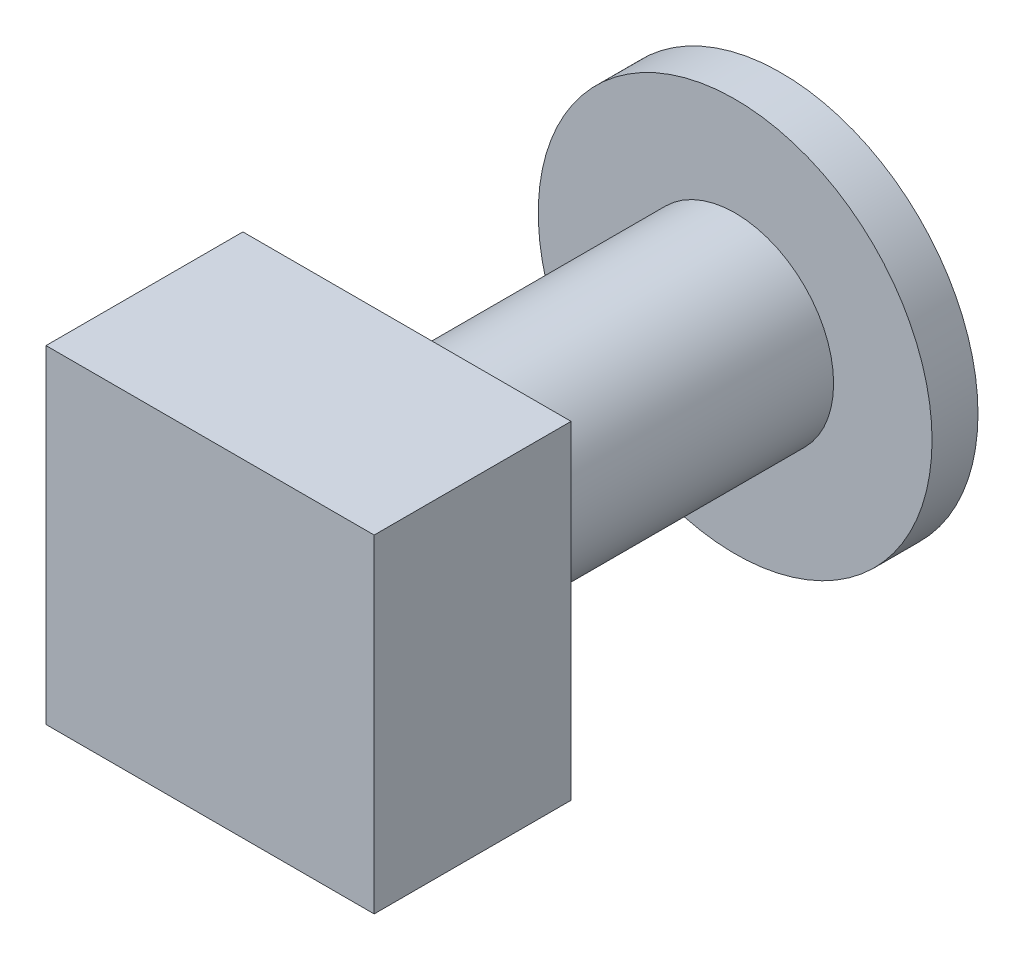
ISO-10303-21;
HEADER;
FILE_DESCRIPTION(('STEP AP214'),'2;1');
FILE_NAME('part.step','',(''),(''),'','','');
FILE_SCHEMA(('AUTOMOTIVE_DESIGN { 1 0 10303 214 1 1 1 1 }'));
ENDSEC;
DATA;
#1=APPLICATION_CONTEXT('core data for automotive mechanical design processes');
#2=APPLICATION_PROTOCOL_DEFINITION('international standard','automotive_design',2000,#1);
#3=PRODUCT_CONTEXT('',#1,'mechanical');
#4=PRODUCT('Part','Part','',(#3));
#5=PRODUCT_RELATED_PRODUCT_CATEGORY('part','',(#4));
#6=PRODUCT_DEFINITION_FORMATION('','',#4);
#7=PRODUCT_DEFINITION_CONTEXT('part definition',#1,'design');
#8=PRODUCT_DEFINITION('design','',#6,#7);
#9=PRODUCT_DEFINITION_SHAPE('','',#8);
#10=(LENGTH_UNIT() NAMED_UNIT(*) SI_UNIT(.MILLI.,.METRE.));
#11=(NAMED_UNIT(*) PLANE_ANGLE_UNIT() SI_UNIT($,.RADIAN.));
#12=(NAMED_UNIT(*) SI_UNIT($,.STERADIAN.) SOLID_ANGLE_UNIT());
#13=UNCERTAINTY_MEASURE_WITH_UNIT(LENGTH_MEASURE(1.E-05),#10,'distance_accuracy_value','');
#14=(GEOMETRIC_REPRESENTATION_CONTEXT(3) GLOBAL_UNCERTAINTY_ASSIGNED_CONTEXT((#13)) GLOBAL_UNIT_ASSIGNED_CONTEXT((#10,
#11,#12)) REPRESENTATION_CONTEXT('',''));
#15=CARTESIAN_POINT('',(0.,0.,0.));
#16=DIRECTION('',(0.,0.,1.));
#17=DIRECTION('',(1.,0.,0.));
#18=AXIS2_PLACEMENT_3D('',#15,#16,#17);
#19=CARTESIAN_POINT('',(0.,0.,7.));
#20=DIRECTION('',(0.,0.,-1.));
#21=DIRECTION('',(-1.,0.,0.));
#22=AXIS2_PLACEMENT_3D('',#19,#20,#21);
#23=CYLINDRICAL_SURFACE('',#22,30.);
#24=CARTESIAN_POINT('',(0.,0.,7.));
#25=DIRECTION('',(0.,0.,1.));
#26=DIRECTION('',(1.,0.,0.));
#27=AXIS2_PLACEMENT_3D('',#24,#25,#26);
#28=CIRCLE('',#27,30.);
#29=CARTESIAN_POINT('',(30.,0.,7.));
#30=VERTEX_POINT('',#29);
#31=EDGE_CURVE('E11',#30,#30,#28,.T.);
#32=ORIENTED_EDGE('',*,*,#31,.F.);
#33=EDGE_LOOP('',(#32));
#34=FACE_BOUND('',#33,.T.);
#35=CARTESIAN_POINT('',(0.,0.,0.));
#36=DIRECTION('',(0.,0.,1.));
#37=DIRECTION('',(1.,0.,0.));
#38=AXIS2_PLACEMENT_3D('',#35,#36,#37);
#39=CIRCLE('',#38,30.);
#40=CARTESIAN_POINT('',(30.,0.,0.));
#41=VERTEX_POINT('',#40);
#42=EDGE_CURVE('E35',#41,#41,#39,.T.);
#43=ORIENTED_EDGE('',*,*,#42,.T.);
#44=EDGE_LOOP('',(#43));
#45=FACE_BOUND('',#44,.T.);
#46=ADVANCED_FACE('F32',(#34,#45),#23,.T.);
#47=CARTESIAN_POINT('',(0.,0.,7.));
#48=DIRECTION('',(0.,0.,1.));
#49=DIRECTION('',(1.,0.,0.));
#50=AXIS2_PLACEMENT_3D('',#47,#48,#49);
#51=PLANE('',#50);
#52=CARTESIAN_POINT('',(0.,0.,7.));
#53=DIRECTION('',(0.,0.,1.));
#54=DIRECTION('',(1.,0.,0.));
#55=AXIS2_PLACEMENT_3D('',#52,#53,#54);
#56=CIRCLE('',#55,15.);
#57=CARTESIAN_POINT('',(15.,0.,7.));
#58=VERTEX_POINT('',#57);
#59=EDGE_CURVE('E108',#58,#58,#56,.T.);
#60=ORIENTED_EDGE('',*,*,#59,.F.);
#61=EDGE_LOOP('',(#60));
#62=FACE_BOUND('',#61,.T.);
#63=ORIENTED_EDGE('',*,*,#31,.T.);
#64=EDGE_LOOP('',(#63));
#65=FACE_BOUND('',#64,.T.);
#66=ADVANCED_FACE('F117',(#62,#65),#51,.T.);
#67=CARTESIAN_POINT('',(0.,0.,0.));
#68=DIRECTION('',(0.,0.,1.));
#69=DIRECTION('',(1.,0.,0.));
#70=AXIS2_PLACEMENT_3D('',#67,#68,#69);
#71=PLANE('',#70);
#72=ORIENTED_EDGE('',*,*,#42,.F.);
#73=EDGE_LOOP('',(#72));
#74=FACE_BOUND('',#73,.T.);
#75=ADVANCED_FACE('F120',(#74),#71,.F.);
#76=CARTESIAN_POINT('',(0.,0.,57.));
#77=DIRECTION('',(0.,0.,-1.));
#78=DIRECTION('',(-1.,0.,0.));
#79=AXIS2_PLACEMENT_3D('',#76,#77,#78);
#80=CYLINDRICAL_SURFACE('',#79,15.);
#81=CARTESIAN_POINT('',(0.,0.,57.));
#82=DIRECTION('',(0.,0.,1.));
#83=DIRECTION('',(1.,0.,0.));
#84=AXIS2_PLACEMENT_3D('',#81,#82,#83);
#85=CIRCLE('',#84,15.);
#86=CARTESIAN_POINT('',(15.,0.,57.));
#87=VERTEX_POINT('',#86);
#88=EDGE_CURVE('E109',#87,#87,#85,.T.);
#89=ORIENTED_EDGE('',*,*,#88,.F.);
#90=EDGE_LOOP('',(#89));
#91=FACE_BOUND('',#90,.T.);
#92=ORIENTED_EDGE('',*,*,#59,.T.);
#93=EDGE_LOOP('',(#92));
#94=FACE_BOUND('',#93,.T.);
#95=ADVANCED_FACE('F115',(#91,#94),#80,.T.);
#96=CARTESIAN_POINT('',(25.,-25.,87.));
#97=DIRECTION('',(-1.,0.,0.));
#98=DIRECTION('',(0.,0.,1.));
#99=AXIS2_PLACEMENT_3D('',#96,#97,#98);
#100=PLANE('',#99);
#101=DIRECTION('',(0.,1.,0.));
#102=VECTOR('',#101,1.);
#103=CARTESIAN_POINT('',(25.,-25.,57.));
#104=LINE('',#103,#102);
#105=CARTESIAN_POINT('',(25.,-25.,57.));
#106=VERTEX_POINT('',#105);
#107=CARTESIAN_POINT('',(25.,25.,57.));
#108=VERTEX_POINT('',#107);
#109=EDGE_CURVE('E99',#106,#108,#104,.T.);
#110=ORIENTED_EDGE('',*,*,#109,.T.);
#111=DIRECTION('',(0.,0.,-1.));
#112=VECTOR('',#111,1.);
#113=CARTESIAN_POINT('',(25.,25.,87.));
#114=LINE('',#113,#112);
#115=CARTESIAN_POINT('',(25.,25.,87.));
#116=VERTEX_POINT('',#115);
#117=EDGE_CURVE('E90',#116,#108,#114,.T.);
#118=ORIENTED_EDGE('',*,*,#117,.F.);
#119=DIRECTION('',(0.,1.,0.));
#120=VECTOR('',#119,1.);
#121=CARTESIAN_POINT('',(25.,-25.,87.));
#122=LINE('',#121,#120);
#123=CARTESIAN_POINT('',(25.,-25.,87.));
#124=VERTEX_POINT('',#123);
#125=EDGE_CURVE('E84',#124,#116,#122,.T.);
#126=ORIENTED_EDGE('',*,*,#125,.F.);
#127=DIRECTION('',(0.,0.,-1.));
#128=VECTOR('',#127,1.);
#129=CARTESIAN_POINT('',(25.,-25.,87.));
#130=LINE('',#129,#128);
#131=EDGE_CURVE('E95',#124,#106,#130,.T.);
#132=ORIENTED_EDGE('',*,*,#131,.T.);
#133=EDGE_LOOP('',(#110,#118,#126,#132));
#134=FACE_BOUND('',#133,.T.);
#135=ADVANCED_FACE('F133',(#134),#100,.F.);
#136=CARTESIAN_POINT('',(-25.,25.,87.));
#137=DIRECTION('',(0.,-1.,0.));
#138=DIRECTION('',(1.,0.,0.));
#139=AXIS2_PLACEMENT_3D('',#136,#137,#138);
#140=PLANE('',#139);
#141=DIRECTION('',(-1.,0.,0.));
#142=VECTOR('',#141,1.);
#143=CARTESIAN_POINT('',(-25.,25.,57.));
#144=LINE('',#143,#142);
#145=CARTESIAN_POINT('',(-25.,25.,57.));
#146=VERTEX_POINT('',#145);
#147=EDGE_CURVE('E89',#108,#146,#144,.T.);
#148=ORIENTED_EDGE('',*,*,#147,.T.);
#149=DIRECTION('',(0.,0.,-1.));
#150=VECTOR('',#149,1.);
#151=CARTESIAN_POINT('',(-25.,25.,87.));
#152=LINE('',#151,#150);
#153=CARTESIAN_POINT('',(-25.,25.,87.));
#154=VERTEX_POINT('',#153);
#155=EDGE_CURVE('E87',#154,#146,#152,.T.);
#156=ORIENTED_EDGE('',*,*,#155,.F.);
#157=DIRECTION('',(-1.,0.,0.));
#158=VECTOR('',#157,1.);
#159=CARTESIAN_POINT('',(-25.,25.,87.));
#160=LINE('',#159,#158);
#161=EDGE_CURVE('E79',#116,#154,#160,.T.);
#162=ORIENTED_EDGE('',*,*,#161,.F.);
#163=ORIENTED_EDGE('',*,*,#117,.T.);
#164=EDGE_LOOP('',(#148,#156,#162,#163));
#165=FACE_BOUND('',#164,.T.);
#166=ADVANCED_FACE('F88',(#165),#140,.F.);
#167=CARTESIAN_POINT('',(-25.,-25.,87.));
#168=DIRECTION('',(1.,0.,0.));
#169=DIRECTION('',(0.,0.,-1.));
#170=AXIS2_PLACEMENT_3D('',#167,#168,#169);
#171=PLANE('',#170);
#172=DIRECTION('',(0.,-1.,0.));
#173=VECTOR('',#172,1.);
#174=CARTESIAN_POINT('',(-25.,-25.,57.));
#175=LINE('',#174,#173);
#176=CARTESIAN_POINT('',(-25.,-25.,57.));
#177=VERTEX_POINT('',#176);
#178=EDGE_CURVE('E65',#146,#177,#175,.T.);
#179=ORIENTED_EDGE('',*,*,#178,.T.);
#180=DIRECTION('',(0.,0.,-1.));
#181=VECTOR('',#180,1.);
#182=CARTESIAN_POINT('',(-25.,-25.,87.));
#183=LINE('',#182,#181);
#184=CARTESIAN_POINT('',(-25.,-25.,87.));
#185=VERTEX_POINT('',#184);
#186=EDGE_CURVE('E91',#185,#177,#183,.T.);
#187=ORIENTED_EDGE('',*,*,#186,.F.);
#188=DIRECTION('',(0.,-1.,0.));
#189=VECTOR('',#188,1.);
#190=CARTESIAN_POINT('',(-25.,-25.,87.));
#191=LINE('',#190,#189);
#192=EDGE_CURVE('E82',#154,#185,#191,.T.);
#193=ORIENTED_EDGE('',*,*,#192,.F.);
#194=ORIENTED_EDGE('',*,*,#155,.T.);
#195=EDGE_LOOP('',(#179,#187,#193,#194));
#196=FACE_BOUND('',#195,.T.);
#197=ADVANCED_FACE('F93',(#196),#171,.F.);
#198=CARTESIAN_POINT('',(-25.,-25.,87.));
#199=DIRECTION('',(0.,1.,0.));
#200=DIRECTION('',(-1.,0.,0.));
#201=AXIS2_PLACEMENT_3D('',#198,#199,#200);
#202=PLANE('',#201);
#203=DIRECTION('',(1.,0.,0.));
#204=VECTOR('',#203,1.);
#205=CARTESIAN_POINT('',(-25.,-25.,57.));
#206=LINE('',#205,#204);
#207=EDGE_CURVE('E71',#177,#106,#206,.T.);
#208=ORIENTED_EDGE('',*,*,#207,.T.);
#209=ORIENTED_EDGE('',*,*,#131,.F.);
#210=DIRECTION('',(1.,0.,0.));
#211=VECTOR('',#210,1.);
#212=CARTESIAN_POINT('',(-25.,-25.,87.));
#213=LINE('',#212,#211);
#214=EDGE_CURVE('E48',#185,#124,#213,.T.);
#215=ORIENTED_EDGE('',*,*,#214,.F.);
#216=ORIENTED_EDGE('',*,*,#186,.T.);
#217=EDGE_LOOP('',(#208,#209,#215,#216));
#218=FACE_BOUND('',#217,.T.);
#219=ADVANCED_FACE('F144',(#218),#202,.F.);
#220=CARTESIAN_POINT('',(0.,0.,87.));
#221=DIRECTION('',(0.,0.,-1.));
#222=DIRECTION('',(-1.,0.,0.));
#223=AXIS2_PLACEMENT_3D('',#220,#221,#222);
#224=PLANE('',#223);
#225=ORIENTED_EDGE('',*,*,#125,.T.);
#226=ORIENTED_EDGE('',*,*,#161,.T.);
#227=ORIENTED_EDGE('',*,*,#192,.T.);
#228=ORIENTED_EDGE('',*,*,#214,.T.);
#229=EDGE_LOOP('',(#225,#226,#227,#228));
#230=FACE_BOUND('',#229,.T.);
#231=ADVANCED_FACE('F80',(#230),#224,.F.);
#232=CARTESIAN_POINT('',(0.,0.,57.));
#233=DIRECTION('',(0.,0.,-1.));
#234=DIRECTION('',(-1.,0.,0.));
#235=AXIS2_PLACEMENT_3D('',#232,#233,#234);
#236=PLANE('',#235);
#237=ORIENTED_EDGE('',*,*,#88,.T.);
#238=EDGE_LOOP('',(#237));
#239=FACE_BOUND('',#238,.T.);
#240=ORIENTED_EDGE('',*,*,#109,.F.);
#241=ORIENTED_EDGE('',*,*,#207,.F.);
#242=ORIENTED_EDGE('',*,*,#178,.F.);
#243=ORIENTED_EDGE('',*,*,#147,.F.);
#244=EDGE_LOOP('',(#240,#241,#242,#243));
#245=FACE_BOUND('',#244,.T.);
#246=ADVANCED_FACE('F147',(#239,#245),#236,.T.);
#247=CLOSED_SHELL('',(#46,#66,#75,#95,#135,#166,#197,#219,#231,#246));
#248=MANIFOLD_SOLID_BREP('B2',#247);
#249=ADVANCED_BREP_SHAPE_REPRESENTATION('',(#18,#248),#14);
#250=SHAPE_DEFINITION_REPRESENTATION(#9,#249);
ENDSEC;
END-ISO-10303-21;
